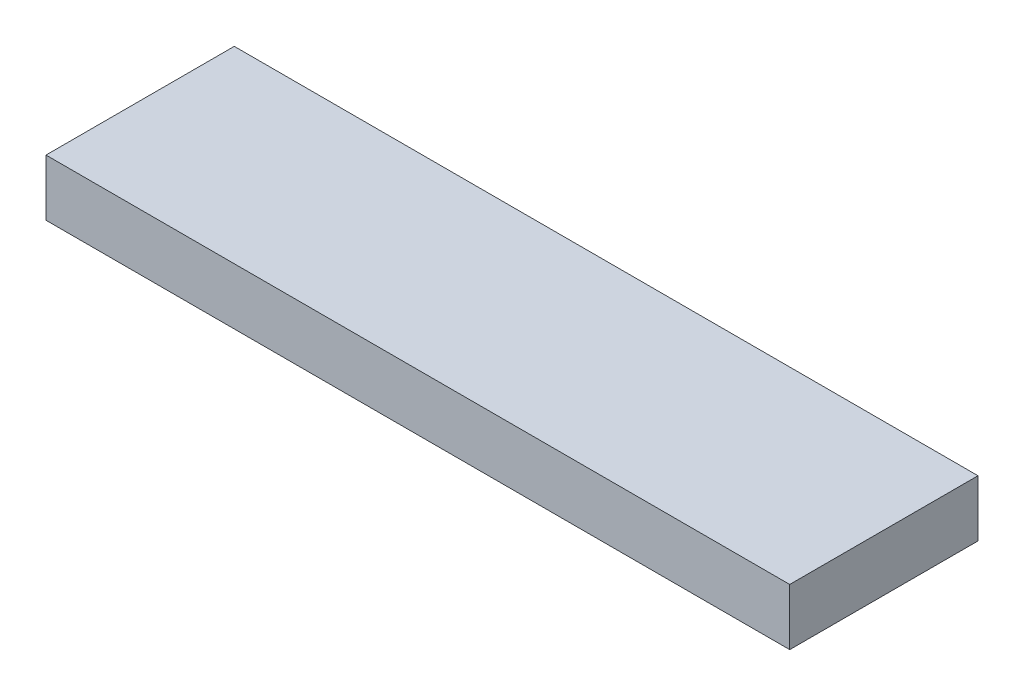
ISO-10303-21;
HEADER;
FILE_DESCRIPTION(('STEP AP214'),'2;1');
FILE_NAME('part.step','',(''),(''),'','','');
FILE_SCHEMA(('AUTOMOTIVE_DESIGN { 1 0 10303 214 1 1 1 1 }'));
ENDSEC;
DATA;
#1=APPLICATION_CONTEXT('core data for automotive mechanical design processes');
#2=APPLICATION_PROTOCOL_DEFINITION('international standard','automotive_design',2000,#1);
#3=PRODUCT_CONTEXT('',#1,'mechanical');
#4=PRODUCT('Part','Part','',(#3));
#5=PRODUCT_RELATED_PRODUCT_CATEGORY('part','',(#4));
#6=PRODUCT_DEFINITION_FORMATION('','',#4);
#7=PRODUCT_DEFINITION_CONTEXT('part definition',#1,'design');
#8=PRODUCT_DEFINITION('design','',#6,#7);
#9=PRODUCT_DEFINITION_SHAPE('','',#8);
#10=(LENGTH_UNIT() NAMED_UNIT(*) SI_UNIT(.MILLI.,.METRE.));
#11=(NAMED_UNIT(*) PLANE_ANGLE_UNIT() SI_UNIT($,.RADIAN.));
#12=(NAMED_UNIT(*) SI_UNIT($,.STERADIAN.) SOLID_ANGLE_UNIT());
#13=UNCERTAINTY_MEASURE_WITH_UNIT(LENGTH_MEASURE(1.E-05),#10,'distance_accuracy_value','');
#14=(GEOMETRIC_REPRESENTATION_CONTEXT(3) GLOBAL_UNCERTAINTY_ASSIGNED_CONTEXT((#13)) GLOBAL_UNIT_ASSIGNED_CONTEXT((#10,
#11,#12)) REPRESENTATION_CONTEXT('',''));
#15=CARTESIAN_POINT('',(0.,0.,0.));
#16=DIRECTION('',(0.,0.,1.));
#17=DIRECTION('',(1.,0.,0.));
#18=AXIS2_PLACEMENT_3D('',#15,#16,#17);
#19=CARTESIAN_POINT('',(-1351.82038834951,300.,-642.354368932039));
#20=DIRECTION('',(1.,0.,0.));
#21=DIRECTION('',(0.,0.,-1.));
#22=AXIS2_PLACEMENT_3D('',#19,#20,#21);
#23=PLANE('',#22);
#24=DIRECTION('',(0.,0.,1.));
#25=VECTOR('',#24,1.);
#26=CARTESIAN_POINT('',(-1351.82038834951,0.,-642.354368932039));
#27=LINE('',#26,#25);
#28=CARTESIAN_POINT('',(-1351.82038834951,0.,-642.354368932039));
#29=VERTEX_POINT('',#28);
#30=CARTESIAN_POINT('',(-1351.82038834951,0.,357.645631067961));
#31=VERTEX_POINT('',#30);
#32=EDGE_CURVE('E96',#29,#31,#27,.T.);
#33=ORIENTED_EDGE('',*,*,#32,.T.);
#34=DIRECTION('',(0.,-1.,0.));
#35=VECTOR('',#34,1.);
#36=CARTESIAN_POINT('',(-1351.82038834951,300.,357.645631067961));
#37=LINE('',#36,#35);
#38=CARTESIAN_POINT('',(-1351.82038834951,300.,357.645631067961));
#39=VERTEX_POINT('',#38);
#40=EDGE_CURVE('E11',#39,#31,#37,.T.);
#41=ORIENTED_EDGE('',*,*,#40,.F.);
#42=DIRECTION('',(0.,0.,1.));
#43=VECTOR('',#42,1.);
#44=CARTESIAN_POINT('',(-1351.82038834951,300.,-642.354368932039));
#45=LINE('',#44,#43);
#46=CARTESIAN_POINT('',(-1351.82038834951,300.,-642.354368932039));
#47=VERTEX_POINT('',#46);
#48=EDGE_CURVE('E84',#47,#39,#45,.T.);
#49=ORIENTED_EDGE('',*,*,#48,.F.);
#50=DIRECTION('',(0.,-1.,0.));
#51=VECTOR('',#50,1.);
#52=CARTESIAN_POINT('',(-1351.82038834951,300.,-642.354368932039));
#53=LINE('',#52,#51);
#54=EDGE_CURVE('E92',#47,#29,#53,.T.);
#55=ORIENTED_EDGE('',*,*,#54,.T.);
#56=EDGE_LOOP('',(#33,#41,#49,#55));
#57=FACE_BOUND('',#56,.T.);
#58=ADVANCED_FACE('F33',(#57),#23,.F.);
#59=CARTESIAN_POINT('',(-1351.82038834951,300.,357.645631067961));
#60=DIRECTION('',(0.,0.,-1.));
#61=DIRECTION('',(-1.,0.,0.));
#62=AXIS2_PLACEMENT_3D('',#59,#60,#61);
#63=PLANE('',#62);
#64=DIRECTION('',(1.,0.,0.));
#65=VECTOR('',#64,1.);
#66=CARTESIAN_POINT('',(-1351.82038834951,0.,357.645631067961));
#67=LINE('',#66,#65);
#68=CARTESIAN_POINT('',(2598.17961165049,0.,357.645631067961));
#69=VERTEX_POINT('',#68);
#70=EDGE_CURVE('E88',#31,#69,#67,.T.);
#71=ORIENTED_EDGE('',*,*,#70,.T.);
#72=DIRECTION('',(0.,-1.,0.));
#73=VECTOR('',#72,1.);
#74=CARTESIAN_POINT('',(2598.17961165049,300.,357.645631067961));
#75=LINE('',#74,#73);
#76=CARTESIAN_POINT('',(2598.17961165049,300.,357.645631067961));
#77=VERTEX_POINT('',#76);
#78=EDGE_CURVE('E41',#77,#69,#75,.T.);
#79=ORIENTED_EDGE('',*,*,#78,.F.);
#80=DIRECTION('',(1.,0.,0.));
#81=VECTOR('',#80,1.);
#82=CARTESIAN_POINT('',(-1351.82038834951,300.,357.645631067961));
#83=LINE('',#82,#81);
#84=EDGE_CURVE('E79',#39,#77,#83,.T.);
#85=ORIENTED_EDGE('',*,*,#84,.F.);
#86=ORIENTED_EDGE('',*,*,#40,.T.);
#87=EDGE_LOOP('',(#71,#79,#85,#86));
#88=FACE_BOUND('',#87,.T.);
#89=ADVANCED_FACE('F87',(#88),#63,.F.);
#90=CARTESIAN_POINT('',(2598.17961165049,300.,-642.354368932039));
#91=DIRECTION('',(-1.,0.,0.));
#92=DIRECTION('',(0.,0.,1.));
#93=AXIS2_PLACEMENT_3D('',#90,#91,#92);
#94=PLANE('',#93);
#95=DIRECTION('',(0.,0.,-1.));
#96=VECTOR('',#95,1.);
#97=CARTESIAN_POINT('',(2598.17961165049,0.,-642.354368932039));
#98=LINE('',#97,#96);
#99=CARTESIAN_POINT('',(2598.17961165049,0.,-642.354368932039));
#100=VERTEX_POINT('',#99);
#101=EDGE_CURVE('E66',#69,#100,#98,.T.);
#102=ORIENTED_EDGE('',*,*,#101,.T.);
#103=DIRECTION('',(0.,-1.,0.));
#104=VECTOR('',#103,1.);
#105=CARTESIAN_POINT('',(2598.17961165049,300.,-642.354368932039));
#106=LINE('',#105,#104);
#107=CARTESIAN_POINT('',(2598.17961165049,300.,-642.354368932039));
#108=VERTEX_POINT('',#107);
#109=EDGE_CURVE('E89',#108,#100,#106,.T.);
#110=ORIENTED_EDGE('',*,*,#109,.F.);
#111=DIRECTION('',(0.,0.,-1.));
#112=VECTOR('',#111,1.);
#113=CARTESIAN_POINT('',(2598.17961165049,300.,-642.354368932039));
#114=LINE('',#113,#112);
#115=EDGE_CURVE('E82',#77,#108,#114,.T.);
#116=ORIENTED_EDGE('',*,*,#115,.F.);
#117=ORIENTED_EDGE('',*,*,#78,.T.);
#118=EDGE_LOOP('',(#102,#110,#116,#117));
#119=FACE_BOUND('',#118,.T.);
#120=ADVANCED_FACE('F90',(#119),#94,.F.);
#121=CARTESIAN_POINT('',(-1351.82038834951,300.,-642.354368932039));
#122=DIRECTION('',(0.,0.,1.));
#123=DIRECTION('',(1.,0.,0.));
#124=AXIS2_PLACEMENT_3D('',#121,#122,#123);
#125=PLANE('',#124);
#126=DIRECTION('',(-1.,0.,0.));
#127=VECTOR('',#126,1.);
#128=CARTESIAN_POINT('',(-1351.82038834951,0.,-642.354368932039));
#129=LINE('',#128,#127);
#130=EDGE_CURVE('E72',#100,#29,#129,.T.);
#131=ORIENTED_EDGE('',*,*,#130,.T.);
#132=ORIENTED_EDGE('',*,*,#54,.F.);
#133=DIRECTION('',(-1.,0.,0.));
#134=VECTOR('',#133,1.);
#135=CARTESIAN_POINT('',(-1351.82038834951,300.,-642.354368932039));
#136=LINE('',#135,#134);
#137=EDGE_CURVE('E49',#108,#47,#136,.T.);
#138=ORIENTED_EDGE('',*,*,#137,.F.);
#139=ORIENTED_EDGE('',*,*,#109,.T.);
#140=EDGE_LOOP('',(#131,#132,#138,#139));
#141=FACE_BOUND('',#140,.T.);
#142=ADVANCED_FACE('F103',(#141),#125,.F.);
#143=CARTESIAN_POINT('',(0.,300.,0.));
#144=DIRECTION('',(0.,1.,0.));
#145=DIRECTION('',(0.,0.,1.));
#146=AXIS2_PLACEMENT_3D('',#143,#144,#145);
#147=PLANE('',#146);
#148=ORIENTED_EDGE('',*,*,#48,.T.);
#149=ORIENTED_EDGE('',*,*,#84,.T.);
#150=ORIENTED_EDGE('',*,*,#115,.T.);
#151=ORIENTED_EDGE('',*,*,#137,.T.);
#152=EDGE_LOOP('',(#148,#149,#150,#151));
#153=FACE_BOUND('',#152,.T.);
#154=ADVANCED_FACE('F80',(#153),#147,.T.);
#155=CARTESIAN_POINT('',(0.,0.,0.));
#156=DIRECTION('',(0.,1.,0.));
#157=DIRECTION('',(0.,0.,1.));
#158=AXIS2_PLACEMENT_3D('',#155,#156,#157);
#159=PLANE('',#158);
#160=ORIENTED_EDGE('',*,*,#32,.F.);
#161=ORIENTED_EDGE('',*,*,#130,.F.);
#162=ORIENTED_EDGE('',*,*,#101,.F.);
#163=ORIENTED_EDGE('',*,*,#70,.F.);
#164=EDGE_LOOP('',(#160,#161,#162,#163));
#165=FACE_BOUND('',#164,.T.);
#166=ADVANCED_FACE('F106',(#165),#159,.F.);
#167=CLOSED_SHELL('',(#58,#89,#120,#142,#154,#166));
#168=MANIFOLD_SOLID_BREP('B2',#167);
#169=ADVANCED_BREP_SHAPE_REPRESENTATION('',(#18,#168),#14);
#170=SHAPE_DEFINITION_REPRESENTATION(#9,#169);
ENDSEC;
END-ISO-10303-21;
